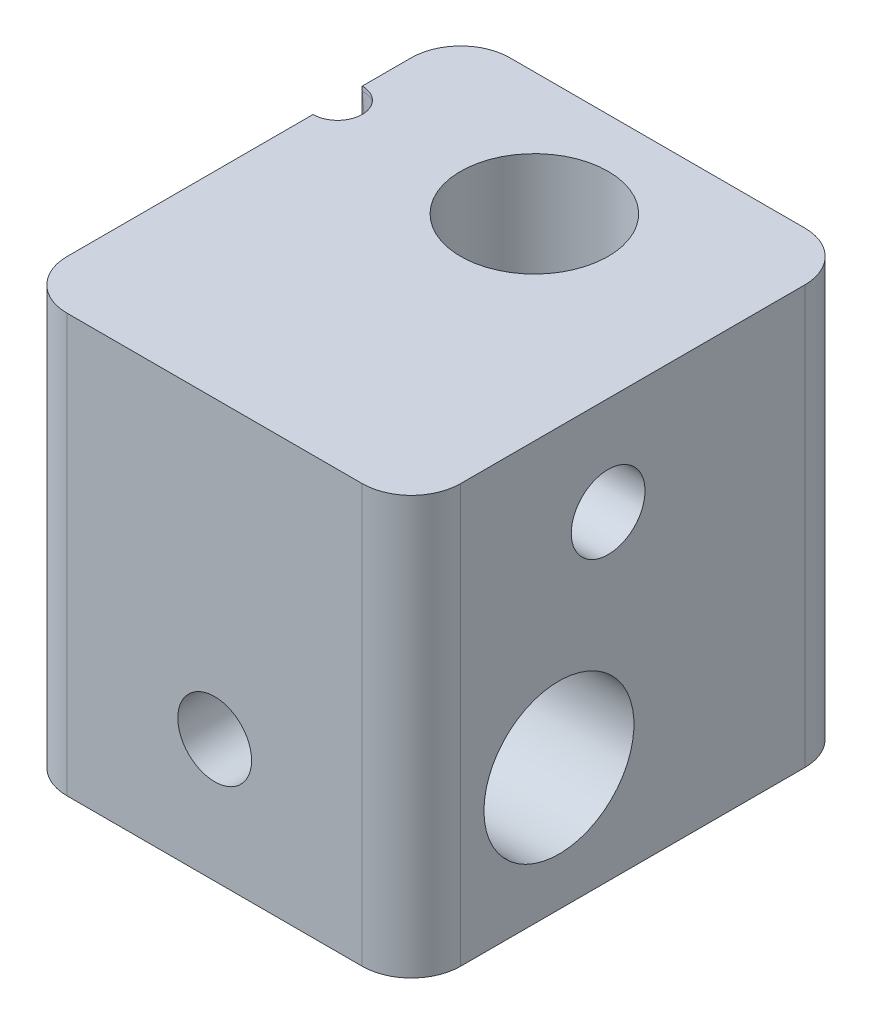
ISO-10303-21;
HEADER;
FILE_DESCRIPTION(('STEP AP214'),'2;1');
FILE_NAME('part.step','',(''),(''),'','','');
FILE_SCHEMA(('AUTOMOTIVE_DESIGN { 1 0 10303 214 1 1 1 1 }'));
ENDSEC;
DATA;
#1=APPLICATION_CONTEXT('core data for automotive mechanical design processes');
#2=APPLICATION_PROTOCOL_DEFINITION('international standard','automotive_design',2000,#1);
#3=PRODUCT_CONTEXT('',#1,'mechanical');
#4=PRODUCT('Part','Part','',(#3));
#5=PRODUCT_RELATED_PRODUCT_CATEGORY('part','',(#4));
#6=PRODUCT_DEFINITION_FORMATION('','',#4);
#7=PRODUCT_DEFINITION_CONTEXT('part definition',#1,'design');
#8=PRODUCT_DEFINITION('design','',#6,#7);
#9=PRODUCT_DEFINITION_SHAPE('','',#8);
#10=(LENGTH_UNIT() NAMED_UNIT(*) SI_UNIT(.MILLI.,.METRE.));
#11=(NAMED_UNIT(*) PLANE_ANGLE_UNIT() SI_UNIT($,.RADIAN.));
#12=(NAMED_UNIT(*) SI_UNIT($,.STERADIAN.) SOLID_ANGLE_UNIT());
#13=UNCERTAINTY_MEASURE_WITH_UNIT(LENGTH_MEASURE(1.E-05),#10,'distance_accuracy_value','');
#14=(GEOMETRIC_REPRESENTATION_CONTEXT(3) GLOBAL_UNCERTAINTY_ASSIGNED_CONTEXT((#13)) GLOBAL_UNIT_ASSIGNED_CONTEXT((#10,
#11,#12)) REPRESENTATION_CONTEXT('',''));
#15=CARTESIAN_POINT('',(0.,0.,0.));
#16=DIRECTION('',(0.,0.,1.));
#17=DIRECTION('',(1.,0.,0.));
#18=AXIS2_PLACEMENT_3D('',#15,#16,#17);
#19=CARTESIAN_POINT('',(-4.98343497282561,-18.5820883092853,0.));
#20=DIRECTION('',(-0.207911690817948,0.978147600733765,0.));
#21=DIRECTION('',(-0.978147600733765,-0.207911690817948,0.));
#22=AXIS2_PLACEMENT_3D('',#19,#20,#21);
#23=CONICAL_SURFACE('',#22,0.999999999755641,1.04719755102138);
#24=CARTESIAN_POINT('',(-4.983434972844,-18.5820883091807,0.));
#25=DIRECTION('',(0.20791169081795,-0.978147600733765,0.));
#26=DIRECTION('',(0.978147600733765,0.20791169081795,0.));
#27=AXIS2_PLACEMENT_3D('',#24,#25,#26);
#28=CIRCLE('',#27,1.000000000003);
#29=CARTESIAN_POINT('',(-4.0052873721073,-18.3741766183621,0.));
#30=VERTEX_POINT('',#29);
#31=EDGE_CURVE('E211',#30,#30,#28,.F.);
#32=ORIENTED_EDGE('',*,*,#31,.T.);
#33=EDGE_LOOP('',(#32));
#34=FACE_BOUND('',#33,.T.);
#35=CARTESIAN_POINT('',(-4.86339710198536,-19.146822089823,0.));
#36=VERTEX_POINT('',#35);
#37=VERTEX_LOOP('',#36);
#38=FACE_BOUND('',#37,.T.);
#39=ADVANCED_FACE('F17',(#34,#38),#23,.F.);
#40=CARTESIAN_POINT('',(-8.,-4.2,0.));
#41=DIRECTION('',(0.,1.,0.));
#42=DIRECTION('',(0.,0.,1.));
#43=AXIS2_PLACEMENT_3D('',#40,#41,#42);
#44=CYLINDRICAL_SURFACE('',#43,1.);
#45=CARTESIAN_POINT('',(-8.,-4.39026565523651,0.));
#46=DIRECTION('',(-0.10452846326775,0.994521895368263,0.));
#47=DIRECTION('',(0.994521895368263,0.104528463267751,0.));
#48=AXIS2_PLACEMENT_3D('',#45,#46,#47);
#49=ELLIPSE('',#48,1.00550827956503,1.0000000000015);
#50=CARTESIAN_POINT('',(-8.,-4.39026565523876,-1.00000000000075));
#51=VERTEX_POINT('',#50);
#52=CARTESIAN_POINT('',(-8.,-4.39026565523876,1.00000000000075));
#53=VERTEX_POINT('',#52);
#54=EDGE_CURVE('E213',#51,#53,#49,.F.);
#55=ORIENTED_EDGE('',*,*,#54,.T.);
#56=DIRECTION('',(0.,1.,0.));
#57=VECTOR('',#56,1.);
#58=CARTESIAN_POINT('',(-8.,-21.2,1.));
#59=LINE('',#58,#57);
#60=CARTESIAN_POINT('',(-8.,-4.2,1.));
#61=VERTEX_POINT('',#60);
#62=EDGE_CURVE('E108',#61,#53,#59,.F.);
#63=ORIENTED_EDGE('',*,*,#62,.F.);
#64=CARTESIAN_POINT('',(-8.,-4.2,0.));
#65=DIRECTION('',(0.,1.,0.));
#66=DIRECTION('',(0.,0.,1.));
#67=AXIS2_PLACEMENT_3D('',#64,#65,#66);
#68=CIRCLE('',#67,1.);
#69=CARTESIAN_POINT('',(-8.,-4.2,-0.999999999999997));
#70=VERTEX_POINT('',#69);
#71=EDGE_CURVE('E20',#70,#61,#68,.F.);
#72=ORIENTED_EDGE('',*,*,#71,.F.);
#73=DIRECTION('',(0.,1.,0.));
#74=VECTOR('',#73,1.);
#75=CARTESIAN_POINT('',(-8.,-4.2,-0.999999999999997));
#76=LINE('',#75,#74);
#77=EDGE_CURVE('E223',#51,#70,#76,.T.);
#78=ORIENTED_EDGE('',*,*,#77,.F.);
#79=EDGE_LOOP('',(#55,#63,#72,#78));
#80=FACE_BOUND('',#79,.T.);
#81=ADVANCED_FACE('F116',(#80),#44,.F.);
#82=CARTESIAN_POINT('',(-8.722304892623,-0.992088309182,0.));
#83=DIRECTION('',(0.20791169081795,-0.978147600733765,0.));
#84=DIRECTION('',(0.978147600733765,0.20791169081795,0.));
#85=AXIS2_PLACEMENT_3D('',#82,#83,#84);
#86=CYLINDRICAL_SURFACE('',#85,1.000000000003);
#87=ORIENTED_EDGE('',*,*,#31,.F.);
#88=EDGE_LOOP('',(#87));
#89=FACE_BOUND('',#88,.T.);
#90=ORIENTED_EDGE('',*,*,#54,.F.);
#91=CARTESIAN_POINT('',(-8.,-4.39026565523651,0.));
#92=DIRECTION('',(0.994521895368263,0.104528463267751,0.));
#93=DIRECTION('',(0.10452846326775,-0.994521895368263,0.));
#94=AXIS2_PLACEMENT_3D('',#91,#92,#93);
#95=ELLIPSE('',#94,9.56677223351109,1.0000000000015);
#96=CARTESIAN_POINT('',(-7.4944765498636,-9.2,-0.86281286578431));
#97=VERTEX_POINT('',#96);
#98=EDGE_CURVE('E216',#51,#97,#95,.F.);
#99=ORIENTED_EDGE('',*,*,#98,.T.);
#100=CARTESIAN_POINT('',(-6.97765940512988,-9.2,0.));
#101=DIRECTION('',(0.,-1.,0.));
#102=DIRECTION('',(1.,0.,0.));
#103=AXIS2_PLACEMENT_3D('',#100,#101,#102);
#104=ELLIPSE('',#103,1.02234059486814,1.000000000003);
#105=CARTESIAN_POINT('',(-7.99999999999901,-9.2,0.));
#106=VERTEX_POINT('',#105);
#107=EDGE_CURVE('E314',#97,#106,#104,.F.);
#108=ORIENTED_EDGE('',*,*,#107,.T.);
#109=CARTESIAN_POINT('',(-6.97765940512988,-9.2,0.));
#110=DIRECTION('',(0.,-1.,0.));
#111=DIRECTION('',(1.,0.,0.));
#112=AXIS2_PLACEMENT_3D('',#109,#110,#111);
#113=ELLIPSE('',#112,1.02234059486814,1.000000000003);
#114=CARTESIAN_POINT('',(-7.4944765498636,-9.2,0.862812865784316));
#115=VERTEX_POINT('',#114);
#116=EDGE_CURVE('E310',#106,#115,#113,.F.);
#117=ORIENTED_EDGE('',*,*,#116,.T.);
#118=CARTESIAN_POINT('',(-8.,-4.39026565523651,0.));
#119=DIRECTION('',(0.994521895368263,0.104528463267751,0.));
#120=DIRECTION('',(0.10452846326775,-0.994521895368263,0.));
#121=AXIS2_PLACEMENT_3D('',#118,#119,#120);
#122=ELLIPSE('',#121,9.56677223351109,1.0000000000015);
#123=EDGE_CURVE('E219',#115,#53,#122,.F.);
#124=ORIENTED_EDGE('',*,*,#123,.T.);
#125=EDGE_LOOP('',(#90,#99,#108,#117,#124));
#126=FACE_BOUND('',#125,.T.);
#127=ADVANCED_FACE('F122',(#89,#126),#86,.F.);
#128=CARTESIAN_POINT('',(0.,-16.2,13.));
#129=DIRECTION('',(0.,0.,1.));
#130=DIRECTION('',(1.,0.,0.));
#131=AXIS2_PLACEMENT_3D('',#128,#129,#130);
#132=CYLINDRICAL_SURFACE('',#131,1.5);
#133=CARTESIAN_POINT('',(1.49999999999999,-16.2,10.05));
#134=CARTESIAN_POINT('',(1.49999588378219,-16.2790792641972,10.0499964023692));
#135=CARTESIAN_POINT('',(1.4937146206715,-16.3582052113933,10.0468937514178));
#136=CARTESIAN_POINT('',(1.46887655214263,-16.5140802642296,10.034795690547));
#137=CARTESIAN_POINT('',(1.45030687607578,-16.5908267893855,10.0257941022894));
#138=CARTESIAN_POINT('',(1.40178960922588,-16.739520297169,10.0028420904239));
#139=CARTESIAN_POINT('',(1.37188161021216,-16.8114829681308,9.98890889836652));
#140=CARTESIAN_POINT('',(1.30175119316785,-16.949284327925,9.95737669583081));
#141=CARTESIAN_POINT('',(1.26152764048032,-17.015122341991,9.93977728212726));
#142=CARTESIAN_POINT('',(1.16920749708672,-17.1431572809057,9.90132428469071));
#143=CARTESIAN_POINT('',(1.11655041695048,-17.2049102019669,9.88033996875372));
#144=CARTESIAN_POINT('',(1.00206351367075,-17.3191131079778,9.83792244125353));
#145=CARTESIAN_POINT('',(0.940227382480664,-17.3715566404527,9.81648892976191));
#146=CARTESIAN_POINT('',(0.803610738906668,-17.4695628816859,9.77376601964667));
#147=CARTESIAN_POINT('',(0.728209398204683,-17.5143231608278,9.75260603119268));
#148=CARTESIAN_POINT('',(0.569792296813912,-17.5903379303135,9.71500847294651));
#149=CARTESIAN_POINT('',(0.486781854183811,-17.6216017674756,9.69856763760734));
#150=CARTESIAN_POINT('',(0.320511773382797,-17.6677416027565,9.67374064375681));
#151=CARTESIAN_POINT('',(0.237555669534098,-17.6834754926647,9.66493656752816));
#152=CARTESIAN_POINT('',(0.0697520563826837,-17.70074333129,9.6552549693639));
#153=CARTESIAN_POINT('',(-0.0150936219133724,-17.7022904740818,9.65437008237748));
#154=CARTESIAN_POINT('',(-0.173807340292347,-17.691771469488,9.66028864036623));
#155=CARTESIAN_POINT('',(-0.247817798860116,-17.6812471604657,9.66622145283045));
#156=CARTESIAN_POINT('',(-0.392845583261894,-17.6495463211888,9.68358691562924));
#157=CARTESIAN_POINT('',(-0.463862003221367,-17.6283665917506,9.69502121768605));
#158=CARTESIAN_POINT('',(-0.602907559836948,-17.5755602721388,9.72235769600561));
#159=CARTESIAN_POINT('',(-0.670828314810596,-17.5437014321888,9.73835790600877));
#160=CARTESIAN_POINT('',(-0.800679367603549,-17.4706178186129,9.773024393655));
#161=CARTESIAN_POINT('',(-0.862607103858366,-17.429389065044,9.79169180295681));
#162=CARTESIAN_POINT('',(-0.986673918029993,-17.3328643375092,9.83234536250517));
#163=CARTESIAN_POINT('',(-1.04791632921342,-17.2764656184389,9.85445849382707));
#164=CARTESIAN_POINT('',(-1.16045236324747,-17.1540780822321,9.89766218376757));
#165=CARTESIAN_POINT('',(-1.21173956827048,-17.0880831263123,9.91875207620763));
#166=CARTESIAN_POINT('',(-1.30500608339111,-16.9447073368076,9.95866276652997));
#167=CARTESIAN_POINT('',(-1.34647551548213,-16.8669528721426,9.97734258421105));
#168=CARTESIAN_POINT('',(-1.41536517523436,-16.704471949135,10.0091224868255));
#169=CARTESIAN_POINT('',(-1.44281228330905,-16.6197591944417,10.0222332393067));
#170=CARTESIAN_POINT('',(-1.47495998532321,-16.4785936318639,10.0377455452616));
#171=CARTESIAN_POINT('',(-1.4843272732221,-16.423400302244,10.0423179252092));
#172=CARTESIAN_POINT('',(-1.49684847485947,-16.3121457591359,10.0484462995146));
#173=CARTESIAN_POINT('',(-1.50000291930527,-16.2560846201892,10.0500025515129));
#174=CARTESIAN_POINT('',(-1.4999958837822,-16.1209207358028,10.0499964023692));
#175=CARTESIAN_POINT('',(-1.49371462067152,-16.0417947886067,10.0468937514178));
#176=CARTESIAN_POINT('',(-1.46887655214264,-15.8859197357704,10.034795690547));
#177=CARTESIAN_POINT('',(-1.4503068760758,-15.8091732106145,10.0257941022894));
#178=CARTESIAN_POINT('',(-1.4017896092259,-15.660479702831,10.0028420904239));
#179=CARTESIAN_POINT('',(-1.37188161021217,-15.5885170318692,9.98890889836652));
#180=CARTESIAN_POINT('',(-1.30175119316786,-15.450715672075,9.95737669583081));
#181=CARTESIAN_POINT('',(-1.26152764048034,-15.384877658009,9.93977728212726));
#182=CARTESIAN_POINT('',(-1.16920749708674,-15.2568427190943,9.90132428469071));
#183=CARTESIAN_POINT('',(-1.11655041695049,-15.1950897980331,9.88033996875371));
#184=CARTESIAN_POINT('',(-1.00206351367077,-15.0808868920222,9.83792244125353));
#185=CARTESIAN_POINT('',(-0.94022738248068,-15.0284433595473,9.81648892976191));
#186=CARTESIAN_POINT('',(-0.803610738906686,-14.9304371183141,9.77376601964667));
#187=CARTESIAN_POINT('',(-0.728209398204701,-14.8856768391722,9.75260603119268));
#188=CARTESIAN_POINT('',(-0.569792296813931,-14.8096620696865,9.7150084729465));
#189=CARTESIAN_POINT('',(-0.486781854183829,-14.7783982325244,9.69856763760733));
#190=CARTESIAN_POINT('',(-0.320511773382814,-14.7322583972435,9.67374064375681));
#191=CARTESIAN_POINT('',(-0.237555669534115,-14.7165245073353,9.66493656752816));
#192=CARTESIAN_POINT('',(-0.0697520563826995,-14.69925666871,9.6552549693639));
#193=CARTESIAN_POINT('',(0.0150936219133574,-14.6977095259182,9.65437008237747));
#194=CARTESIAN_POINT('',(0.173807340292332,-14.708228530512,9.66028864036623));
#195=CARTESIAN_POINT('',(0.247817798860101,-14.7187528395343,9.66622145283044));
#196=CARTESIAN_POINT('',(0.392845583261879,-14.7504536788112,9.68358691562924));
#197=CARTESIAN_POINT('',(0.463862003221352,-14.7716334082494,9.69502121768604));
#198=CARTESIAN_POINT('',(0.602907559836932,-14.8244397278612,9.72235769600561));
#199=CARTESIAN_POINT('',(0.670828314810579,-14.8562985678112,9.73835790600877));
#200=CARTESIAN_POINT('',(0.800679367603532,-14.9293821813871,9.773024393655));
#201=CARTESIAN_POINT('',(0.86260710385835,-14.970610934956,9.7916918029568));
#202=CARTESIAN_POINT('',(0.986673918029977,-15.0671356624908,9.83234536250516));
#203=CARTESIAN_POINT('',(1.0479163292134,-15.1235343815611,9.85445849382706));
#204=CARTESIAN_POINT('',(1.16045236324746,-15.2459219177679,9.89766218376757));
#205=CARTESIAN_POINT('',(1.21173956827046,-15.3119168736876,9.91875207620763));
#206=CARTESIAN_POINT('',(1.3050060833911,-15.4552926631924,9.95866276652997));
#207=CARTESIAN_POINT('',(1.34647551548212,-15.5330471278574,9.97734258421104));
#208=CARTESIAN_POINT('',(1.41536517523434,-15.695528050865,10.0091224868255));
#209=CARTESIAN_POINT('',(1.44281228330904,-15.7802408055583,10.0222332393067));
#210=CARTESIAN_POINT('',(1.4749599853232,-15.9214063681361,10.0377455452616));
#211=CARTESIAN_POINT('',(1.48432727322209,-15.976599697756,10.0423179252092));
#212=CARTESIAN_POINT('',(1.49684847485946,-16.0878542408641,10.0484462995146));
#213=CARTESIAN_POINT('',(1.50000291930525,-16.1439153798108,10.0500025515129));
#214=CARTESIAN_POINT('',(1.49999999999999,-16.2,10.05));
#215=B_SPLINE_CURVE_WITH_KNOTS('',3,(#133,#134,#135,#136,#137,#138,#139,#140,#141,#142,#143,
#144,#145,#146,#147,#148,#149,#150,#151,#152,#153,#154,#155,#156,#157,#158,#159,#160,#161,#162,
#163,#164,#165,#166,#167,#168,#169,#170,#171,#172,#173,#174,#175,#176,#177,#178,#179,#180,#181,
#182,#183,#184,#185,#186,#187,#188,#189,#190,#191,#192,#193,#194,#195,#196,#197,#198,#199,#200,
#201,#202,#203,#204,#205,#206,#207,#208,#209,#210,#211,#212,#213,#214),.UNSPECIFIED.,.T.,.F.,(4,
2,2,2,2,2,2,2,2,2,2,2,2,2,2,2,2,2,2,2,2,2,2,2,2,2,2,2,2,2,2,2,2,2,2,2,2,2,2,2,4),(0.,
0.237017868723352,0.474284379177947,0.710729908829203,0.947201457414916,1.19762477341366,
1.44822098948347,1.71746501961123,1.98652228733109,2.2397085936752,2.49265940570788,
2.71658248244488,2.94057283000486,3.169790113446,3.39910494126796,3.65640722664034,
3.91387484027444,4.18269037109205,4.45098863783775,4.61910088487096,4.78719877096474,
5.0242166396881,5.26148315014269,5.49792867979394,5.73440022837966,5.9848235443784,
6.23541976044821,6.50466379057596,6.77372105829583,7.02690736463994,7.27985817667262,
7.50378125340962,7.7277716009696,7.95698888441074,8.1863037122327,8.44360599760508,
8.70107361123918,8.96988914205679,9.23818740880249,9.4062996558357,9.57439754192949),.UNSPECIFIED.);
#216=CARTESIAN_POINT('',(1.49999999999999,-16.2,10.05));
#217=VERTEX_POINT('',#216);
#218=EDGE_CURVE('E185',#217,#217,#215,.T.);
#219=ORIENTED_EDGE('',*,*,#218,.T.);
#220=EDGE_LOOP('',(#219));
#221=FACE_BOUND('',#220,.T.);
#222=CARTESIAN_POINT('',(0.,-16.2,13.));
#223=DIRECTION('',(0.,0.,1.));
#224=DIRECTION('',(1.,0.,0.));
#225=AXIS2_PLACEMENT_3D('',#222,#223,#224);
#226=CIRCLE('',#225,1.5);
#227=CARTESIAN_POINT('',(1.49999999999999,-16.2,13.));
#228=VERTEX_POINT('',#227);
#229=EDGE_CURVE('E283',#228,#228,#226,.T.);
#230=ORIENTED_EDGE('',*,*,#229,.T.);
#231=EDGE_LOOP('',(#230));
#232=FACE_BOUND('',#231,.T.);
#233=ADVANCED_FACE('F197',(#221,#232),#132,.F.);
#234=CARTESIAN_POINT('',(-8.,-4.2,0.));
#235=DIRECTION('',(0.,1.,0.));
#236=DIRECTION('',(0.,0.,1.));
#237=AXIS2_PLACEMENT_3D('',#234,#235,#236);
#238=CYLINDRICAL_SURFACE('',#237,1.);
#239=ORIENTED_EDGE('',*,*,#98,.F.);
#240=DIRECTION('',(0.,1.,0.));
#241=VECTOR('',#240,1.);
#242=CARTESIAN_POINT('',(-8.,-21.2,-1.));
#243=LINE('',#242,#241);
#244=CARTESIAN_POINT('',(-8.,-9.2,-0.999999999999999));
#245=VERTEX_POINT('',#244);
#246=EDGE_CURVE('E230',#51,#245,#243,.F.);
#247=ORIENTED_EDGE('',*,*,#246,.T.);
#248=CARTESIAN_POINT('',(-8.,-9.2,0.));
#249=DIRECTION('',(0.,1.,0.));
#250=DIRECTION('',(0.,0.,1.));
#251=AXIS2_PLACEMENT_3D('',#248,#249,#250);
#252=CIRCLE('',#251,1.);
#253=EDGE_CURVE('E231',#245,#97,#252,.F.);
#254=ORIENTED_EDGE('',*,*,#253,.T.);
#255=EDGE_LOOP('',(#239,#247,#254));
#256=FACE_BOUND('',#255,.T.);
#257=ADVANCED_FACE('F202',(#256),#238,.F.);
#258=CARTESIAN_POINT('',(-8.,-9.2,1.));
#259=DIRECTION('',(0.,-1.,0.));
#260=DIRECTION('',(0.,0.,-1.));
#261=AXIS2_PLACEMENT_3D('',#258,#259,#260);
#262=PLANE('',#261);
#263=ORIENTED_EDGE('',*,*,#253,.F.);
#264=DIRECTION('',(0.,0.,-1.));
#265=VECTOR('',#264,1.);
#266=CARTESIAN_POINT('',(-8.,-9.2,-3.));
#267=LINE('',#266,#265);
#268=EDGE_CURVE('E236',#245,#106,#267,.F.);
#269=ORIENTED_EDGE('',*,*,#268,.T.);
#270=ORIENTED_EDGE('',*,*,#107,.F.);
#271=EDGE_LOOP('',(#263,#269,#270));
#272=FACE_BOUND('',#271,.T.);
#273=ADVANCED_FACE('F313',(#272),#262,.F.);
#274=CARTESIAN_POINT('',(-8.,-9.2,-1.));
#275=DIRECTION('',(0.,-1.,0.));
#276=DIRECTION('',(0.,0.,-1.));
#277=AXIS2_PLACEMENT_3D('',#274,#275,#276);
#278=PLANE('',#277);
#279=DIRECTION('',(0.,0.,-1.));
#280=VECTOR('',#279,1.);
#281=CARTESIAN_POINT('',(-8.,-9.2,-3.));
#282=LINE('',#281,#280);
#283=CARTESIAN_POINT('',(-8.,-9.2,1.));
#284=VERTEX_POINT('',#283);
#285=EDGE_CURVE('E239',#106,#284,#282,.F.);
#286=ORIENTED_EDGE('',*,*,#285,.T.);
#287=CARTESIAN_POINT('',(-8.,-9.2,0.));
#288=DIRECTION('',(0.,1.,0.));
#289=DIRECTION('',(0.,0.,1.));
#290=AXIS2_PLACEMENT_3D('',#287,#288,#289);
#291=CIRCLE('',#290,1.);
#292=EDGE_CURVE('E193',#284,#115,#291,.T.);
#293=ORIENTED_EDGE('',*,*,#292,.T.);
#294=ORIENTED_EDGE('',*,*,#116,.F.);
#295=EDGE_LOOP('',(#286,#293,#294));
#296=FACE_BOUND('',#295,.T.);
#297=ADVANCED_FACE('F309',(#296),#278,.F.);
#298=CARTESIAN_POINT('',(-8.,-4.2,0.));
#299=DIRECTION('',(0.,1.,0.));
#300=DIRECTION('',(0.,0.,1.));
#301=AXIS2_PLACEMENT_3D('',#298,#299,#300);
#302=CYLINDRICAL_SURFACE('',#301,1.);
#303=DIRECTION('',(0.,1.,0.));
#304=VECTOR('',#303,1.);
#305=CARTESIAN_POINT('',(-8.,-21.2,1.));
#306=LINE('',#305,#304);
#307=EDGE_CURVE('E305',#284,#53,#306,.T.);
#308=ORIENTED_EDGE('',*,*,#307,.T.);
#309=ORIENTED_EDGE('',*,*,#123,.F.);
#310=ORIENTED_EDGE('',*,*,#292,.F.);
#311=EDGE_LOOP('',(#308,#309,#310));
#312=FACE_BOUND('',#311,.T.);
#313=ADVANCED_FACE('F181',(#312),#302,.F.);
#314=CARTESIAN_POINT('',(-8.,-16.2,7.));
#315=DIRECTION('',(-1.,0.,0.));
#316=DIRECTION('',(0.,0.,1.));
#317=AXIS2_PLACEMENT_3D('',#314,#315,#316);
#318=CYLINDRICAL_SURFACE('',#317,3.05);
#319=CARTESIAN_POINT('',(-8.,-16.2,7.));
#320=DIRECTION('',(-1.,0.,0.));
#321=DIRECTION('',(0.,0.,1.));
#322=AXIS2_PLACEMENT_3D('',#319,#320,#321);
#323=CIRCLE('',#322,3.05);
#324=CARTESIAN_POINT('',(-8.,-16.2,10.05));
#325=VERTEX_POINT('',#324);
#326=EDGE_CURVE('E280',#325,#325,#323,.T.);
#327=ORIENTED_EDGE('',*,*,#326,.T.);
#328=EDGE_LOOP('',(#327));
#329=FACE_BOUND('',#328,.T.);
#330=CARTESIAN_POINT('',(8.,-16.2,7.00000000000001));
#331=DIRECTION('',(-1.,0.,0.));
#332=DIRECTION('',(0.,0.,1.));
#333=AXIS2_PLACEMENT_3D('',#330,#331,#332);
#334=CIRCLE('',#333,3.05);
#335=CARTESIAN_POINT('',(8.,-16.2,10.05));
#336=VERTEX_POINT('',#335);
#337=EDGE_CURVE('E286',#336,#336,#334,.F.);
#338=ORIENTED_EDGE('',*,*,#337,.T.);
#339=EDGE_LOOP('',(#338));
#340=FACE_BOUND('',#339,.T.);
#341=ORIENTED_EDGE('',*,*,#218,.F.);
#342=EDGE_LOOP('',(#341));
#343=FACE_BOUND('',#342,.T.);
#344=ADVANCED_FACE('F176',(#329,#340,#343),#318,.F.);
#345=CARTESIAN_POINT('',(-8.,-8.2,5.));
#346=DIRECTION('',(-1.,0.,0.));
#347=DIRECTION('',(0.,0.,1.));
#348=AXIS2_PLACEMENT_3D('',#345,#346,#347);
#349=CYLINDRICAL_SURFACE('',#348,1.5);
#350=CARTESIAN_POINT('',(8.,-8.20000000000001,5.00000000000001));
#351=DIRECTION('',(-1.,0.,0.));
#352=DIRECTION('',(0.,0.,1.));
#353=AXIS2_PLACEMENT_3D('',#350,#351,#352);
#354=CIRCLE('',#353,1.5);
#355=CARTESIAN_POINT('',(8.,-8.20000000000001,6.50000000000001));
#356=VERTEX_POINT('',#355);
#357=EDGE_CURVE('E194',#356,#356,#354,.F.);
#358=ORIENTED_EDGE('',*,*,#357,.T.);
#359=EDGE_LOOP('',(#358));
#360=FACE_BOUND('',#359,.T.);
#361=CARTESIAN_POINT('',(-8.,-8.2,5.));
#362=DIRECTION('',(-1.,0.,0.));
#363=DIRECTION('',(0.,0.,1.));
#364=AXIS2_PLACEMENT_3D('',#361,#362,#363);
#365=CIRCLE('',#364,1.5);
#366=CARTESIAN_POINT('',(-8.,-8.2,6.5));
#367=VERTEX_POINT('',#366);
#368=EDGE_CURVE('E277',#367,#367,#365,.T.);
#369=ORIENTED_EDGE('',*,*,#368,.T.);
#370=EDGE_LOOP('',(#369));
#371=FACE_BOUND('',#370,.T.);
#372=ADVANCED_FACE('F172',(#360,#371),#349,.F.);
#373=CARTESIAN_POINT('',(-6.,-21.2,-3.));
#374=DIRECTION('',(0.,-1.,0.));
#375=DIRECTION('',(0.,0.,-1.));
#376=AXIS2_PLACEMENT_3D('',#373,#374,#375);
#377=CYLINDRICAL_SURFACE('',#376,2.);
#378=CARTESIAN_POINT('',(-6.,-4.2,-3.));
#379=DIRECTION('',(0.,-1.,0.));
#380=DIRECTION('',(0.,0.,-1.));
#381=AXIS2_PLACEMENT_3D('',#378,#379,#380);
#382=CIRCLE('',#381,2.);
#383=CARTESIAN_POINT('',(-8.,-4.2,-3.));
#384=VERTEX_POINT('',#383);
#385=CARTESIAN_POINT('',(-6.,-4.2,-5.));
#386=VERTEX_POINT('',#385);
#387=EDGE_CURVE('E261',#384,#386,#382,.T.);
#388=ORIENTED_EDGE('',*,*,#387,.T.);
#389=DIRECTION('',(0.,1.,0.));
#390=VECTOR('',#389,1.);
#391=CARTESIAN_POINT('',(-6.,-21.2,-5.00000000000001));
#392=LINE('',#391,#390);
#393=CARTESIAN_POINT('',(-6.,-21.2,-5.));
#394=VERTEX_POINT('',#393);
#395=EDGE_CURVE('E192',#386,#394,#392,.F.);
#396=ORIENTED_EDGE('',*,*,#395,.T.);
#397=CARTESIAN_POINT('',(-6.,-21.2,-3.));
#398=DIRECTION('',(0.,-1.,0.));
#399=DIRECTION('',(0.,0.,-1.));
#400=AXIS2_PLACEMENT_3D('',#397,#398,#399);
#401=CIRCLE('',#400,2.);
#402=CARTESIAN_POINT('',(-8.,-21.2,-3.));
#403=VERTEX_POINT('',#402);
#404=EDGE_CURVE('E275',#403,#394,#401,.T.);
#405=ORIENTED_EDGE('',*,*,#404,.F.);
#406=DIRECTION('',(0.,1.,0.));
#407=VECTOR('',#406,1.);
#408=CARTESIAN_POINT('',(-8.,-21.2,-3.));
#409=LINE('',#408,#407);
#410=EDGE_CURVE('E237',#403,#384,#409,.T.);
#411=ORIENTED_EDGE('',*,*,#410,.T.);
#412=EDGE_LOOP('',(#388,#396,#405,#411));
#413=FACE_BOUND('',#412,.T.);
#414=ADVANCED_FACE('F168',(#413),#377,.T.);
#415=CARTESIAN_POINT('',(6.,-21.2,-5.));
#416=DIRECTION('',(0.,0.,1.));
#417=DIRECTION('',(1.,0.,0.));
#418=AXIS2_PLACEMENT_3D('',#415,#416,#417);
#419=PLANE('',#418);
#420=ORIENTED_EDGE('',*,*,#395,.F.);
#421=DIRECTION('',(1.,0.,0.));
#422=VECTOR('',#421,1.);
#423=CARTESIAN_POINT('',(-8.,-4.2,-5.));
#424=LINE('',#423,#422);
#425=CARTESIAN_POINT('',(6.,-4.2,-5.));
#426=VERTEX_POINT('',#425);
#427=EDGE_CURVE('E260',#386,#426,#424,.T.);
#428=ORIENTED_EDGE('',*,*,#427,.T.);
#429=DIRECTION('',(0.,-1.,0.));
#430=VECTOR('',#429,1.);
#431=CARTESIAN_POINT('',(6.,-21.2,-5.));
#432=LINE('',#431,#430);
#433=CARTESIAN_POINT('',(6.,-21.2,-5.));
#434=VERTEX_POINT('',#433);
#435=EDGE_CURVE('E296',#434,#426,#432,.F.);
#436=ORIENTED_EDGE('',*,*,#435,.F.);
#437=DIRECTION('',(1.,0.,0.));
#438=VECTOR('',#437,1.);
#439=CARTESIAN_POINT('',(-8.,-21.2,-5.));
#440=LINE('',#439,#438);
#441=EDGE_CURVE('E274',#394,#434,#440,.T.);
#442=ORIENTED_EDGE('',*,*,#441,.F.);
#443=EDGE_LOOP('',(#420,#428,#436,#442));
#444=FACE_BOUND('',#443,.T.);
#445=ADVANCED_FACE('F164',(#444),#419,.F.);
#446=CARTESIAN_POINT('',(6.,-21.2,-3.));
#447=DIRECTION('',(0.,-1.,0.));
#448=DIRECTION('',(0.,0.,-1.));
#449=AXIS2_PLACEMENT_3D('',#446,#447,#448);
#450=CYLINDRICAL_SURFACE('',#449,2.);
#451=CARTESIAN_POINT('',(6.,-4.2,-3.));
#452=DIRECTION('',(0.,-1.,0.));
#453=DIRECTION('',(0.,0.,-1.));
#454=AXIS2_PLACEMENT_3D('',#451,#452,#453);
#455=CIRCLE('',#454,2.);
#456=CARTESIAN_POINT('',(8.00000000000001,-4.2,-3.));
#457=VERTEX_POINT('',#456);
#458=EDGE_CURVE('E257',#426,#457,#455,.T.);
#459=ORIENTED_EDGE('',*,*,#458,.T.);
#460=DIRECTION('',(0.,1.,0.));
#461=VECTOR('',#460,1.);
#462=CARTESIAN_POINT('',(8.00000000000001,-21.2,-3.));
#463=LINE('',#462,#461);
#464=CARTESIAN_POINT('',(8.,-21.2,-3.));
#465=VERTEX_POINT('',#464);
#466=EDGE_CURVE('E293',#457,#465,#463,.F.);
#467=ORIENTED_EDGE('',*,*,#466,.T.);
#468=CARTESIAN_POINT('',(6.,-21.2,-3.));
#469=DIRECTION('',(0.,-1.,0.));
#470=DIRECTION('',(0.,0.,-1.));
#471=AXIS2_PLACEMENT_3D('',#468,#469,#470);
#472=CIRCLE('',#471,2.);
#473=EDGE_CURVE('E272',#434,#465,#472,.T.);
#474=ORIENTED_EDGE('',*,*,#473,.F.);
#475=ORIENTED_EDGE('',*,*,#435,.T.);
#476=EDGE_LOOP('',(#459,#467,#474,#475));
#477=FACE_BOUND('',#476,.T.);
#478=ADVANCED_FACE('F160',(#477),#450,.T.);
#479=CARTESIAN_POINT('',(8.,-21.2,11.));
#480=DIRECTION('',(-1.,0.,0.));
#481=DIRECTION('',(0.,0.,1.));
#482=AXIS2_PLACEMENT_3D('',#479,#480,#481);
#483=PLANE('',#482);
#484=ORIENTED_EDGE('',*,*,#337,.F.);
#485=EDGE_LOOP('',(#484));
#486=FACE_BOUND('',#485,.T.);
#487=ORIENTED_EDGE('',*,*,#357,.F.);
#488=EDGE_LOOP('',(#487));
#489=FACE_BOUND('',#488,.T.);
#490=ORIENTED_EDGE('',*,*,#466,.F.);
#491=DIRECTION('',(0.,0.,-1.));
#492=VECTOR('',#491,1.);
#493=CARTESIAN_POINT('',(8.,-4.2,-3.));
#494=LINE('',#493,#492);
#495=CARTESIAN_POINT('',(8.,-4.2,11.));
#496=VERTEX_POINT('',#495);
#497=EDGE_CURVE('E256',#457,#496,#494,.F.);
#498=ORIENTED_EDGE('',*,*,#497,.T.);
#499=DIRECTION('',(0.,-1.,0.));
#500=VECTOR('',#499,1.);
#501=CARTESIAN_POINT('',(8.,-21.2,11.));
#502=LINE('',#501,#500);
#503=CARTESIAN_POINT('',(8.,-21.2,11.));
#504=VERTEX_POINT('',#503);
#505=EDGE_CURVE('E288',#504,#496,#502,.F.);
#506=ORIENTED_EDGE('',*,*,#505,.F.);
#507=DIRECTION('',(0.,0.,-1.));
#508=VECTOR('',#507,1.);
#509=CARTESIAN_POINT('',(8.,-21.2,-3.));
#510=LINE('',#509,#508);
#511=EDGE_CURVE('E271',#465,#504,#510,.F.);
#512=ORIENTED_EDGE('',*,*,#511,.F.);
#513=EDGE_LOOP('',(#490,#498,#506,#512));
#514=FACE_BOUND('',#513,.T.);
#515=ADVANCED_FACE('F156',(#486,#489,#514),#483,.F.);
#516=CARTESIAN_POINT('',(6.,-21.2,11.));
#517=DIRECTION('',(0.,-1.,0.));
#518=DIRECTION('',(0.,0.,-1.));
#519=AXIS2_PLACEMENT_3D('',#516,#517,#518);
#520=CYLINDRICAL_SURFACE('',#519,2.);
#521=CARTESIAN_POINT('',(6.,-4.2,11.));
#522=DIRECTION('',(0.,-1.,0.));
#523=DIRECTION('',(0.,0.,-1.));
#524=AXIS2_PLACEMENT_3D('',#521,#522,#523);
#525=CIRCLE('',#524,2.);
#526=CARTESIAN_POINT('',(6.,-4.2,13.));
#527=VERTEX_POINT('',#526);
#528=EDGE_CURVE('E253',#496,#527,#525,.T.);
#529=ORIENTED_EDGE('',*,*,#528,.T.);
#530=DIRECTION('',(0.,1.,0.));
#531=VECTOR('',#530,1.);
#532=CARTESIAN_POINT('',(6.,-21.2,13.));
#533=LINE('',#532,#531);
#534=CARTESIAN_POINT('',(6.,-21.2,13.));
#535=VERTEX_POINT('',#534);
#536=EDGE_CURVE('E285',#527,#535,#533,.F.);
#537=ORIENTED_EDGE('',*,*,#536,.T.);
#538=CARTESIAN_POINT('',(6.,-21.2,11.));
#539=DIRECTION('',(0.,-1.,0.));
#540=DIRECTION('',(0.,0.,-1.));
#541=AXIS2_PLACEMENT_3D('',#538,#539,#540);
#542=CIRCLE('',#541,2.);
#543=EDGE_CURVE('E269',#504,#535,#542,.T.);
#544=ORIENTED_EDGE('',*,*,#543,.F.);
#545=ORIENTED_EDGE('',*,*,#505,.T.);
#546=EDGE_LOOP('',(#529,#537,#544,#545));
#547=FACE_BOUND('',#546,.T.);
#548=ADVANCED_FACE('F152',(#547),#520,.T.);
#549=CARTESIAN_POINT('',(-6.,-21.2,13.));
#550=DIRECTION('',(0.,0.,-1.));
#551=DIRECTION('',(-1.,0.,0.));
#552=AXIS2_PLACEMENT_3D('',#549,#550,#551);
#553=PLANE('',#552);
#554=ORIENTED_EDGE('',*,*,#229,.F.);
#555=EDGE_LOOP('',(#554));
#556=FACE_BOUND('',#555,.T.);
#557=ORIENTED_EDGE('',*,*,#536,.F.);
#558=DIRECTION('',(1.,0.,0.));
#559=VECTOR('',#558,1.);
#560=CARTESIAN_POINT('',(-8.,-4.2,13.));
#561=LINE('',#560,#559);
#562=CARTESIAN_POINT('',(-6.,-4.2,13.));
#563=VERTEX_POINT('',#562);
#564=EDGE_CURVE('E252',#527,#563,#561,.F.);
#565=ORIENTED_EDGE('',*,*,#564,.T.);
#566=DIRECTION('',(0.,-1.,0.));
#567=VECTOR('',#566,1.);
#568=CARTESIAN_POINT('',(-6.,-21.2,13.));
#569=LINE('',#568,#567);
#570=CARTESIAN_POINT('',(-6.,-21.2,13.));
#571=VERTEX_POINT('',#570);
#572=EDGE_CURVE('E241',#571,#563,#569,.F.);
#573=ORIENTED_EDGE('',*,*,#572,.F.);
#574=DIRECTION('',(1.,0.,0.));
#575=VECTOR('',#574,1.);
#576=CARTESIAN_POINT('',(-8.,-21.2,13.));
#577=LINE('',#576,#575);
#578=EDGE_CURVE('E268',#535,#571,#577,.F.);
#579=ORIENTED_EDGE('',*,*,#578,.F.);
#580=EDGE_LOOP('',(#557,#565,#573,#579));
#581=FACE_BOUND('',#580,.T.);
#582=ADVANCED_FACE('F148',(#556,#581),#553,.F.);
#583=CARTESIAN_POINT('',(-6.,-21.2,11.));
#584=DIRECTION('',(0.,-1.,0.));
#585=DIRECTION('',(0.,0.,-1.));
#586=AXIS2_PLACEMENT_3D('',#583,#584,#585);
#587=CYLINDRICAL_SURFACE('',#586,2.);
#588=CARTESIAN_POINT('',(-6.,-4.2,11.));
#589=DIRECTION('',(0.,-1.,0.));
#590=DIRECTION('',(0.,0.,-1.));
#591=AXIS2_PLACEMENT_3D('',#588,#589,#590);
#592=CIRCLE('',#591,2.);
#593=CARTESIAN_POINT('',(-8.,-4.2,11.));
#594=VERTEX_POINT('',#593);
#595=EDGE_CURVE('E249',#563,#594,#592,.T.);
#596=ORIENTED_EDGE('',*,*,#595,.T.);
#597=DIRECTION('',(0.,1.,0.));
#598=VECTOR('',#597,1.);
#599=CARTESIAN_POINT('',(-8.00000000000001,-21.2,11.));
#600=LINE('',#599,#598);
#601=CARTESIAN_POINT('',(-8.,-21.2,11.));
#602=VERTEX_POINT('',#601);
#603=EDGE_CURVE('E35',#594,#602,#600,.F.);
#604=ORIENTED_EDGE('',*,*,#603,.T.);
#605=CARTESIAN_POINT('',(-6.,-21.2,11.));
#606=DIRECTION('',(0.,-1.,0.));
#607=DIRECTION('',(0.,0.,-1.));
#608=AXIS2_PLACEMENT_3D('',#605,#606,#607);
#609=CIRCLE('',#608,2.);
#610=EDGE_CURVE('E265',#571,#602,#609,.T.);
#611=ORIENTED_EDGE('',*,*,#610,.F.);
#612=ORIENTED_EDGE('',*,*,#572,.T.);
#613=EDGE_LOOP('',(#596,#604,#611,#612));
#614=FACE_BOUND('',#613,.T.);
#615=ADVANCED_FACE('F144',(#614),#587,.T.);
#616=CARTESIAN_POINT('',(-8.,-21.2,-3.));
#617=DIRECTION('',(1.,0.,0.));
#618=DIRECTION('',(0.,0.,-1.));
#619=AXIS2_PLACEMENT_3D('',#616,#617,#618);
#620=PLANE('',#619);
#621=ORIENTED_EDGE('',*,*,#368,.F.);
#622=EDGE_LOOP('',(#621));
#623=FACE_BOUND('',#622,.T.);
#624=ORIENTED_EDGE('',*,*,#326,.F.);
#625=EDGE_LOOP('',(#624));
#626=FACE_BOUND('',#625,.T.);
#627=DIRECTION('',(0.,0.,-1.));
#628=VECTOR('',#627,1.);
#629=CARTESIAN_POINT('',(-8.,-4.2,-3.));
#630=LINE('',#629,#628);
#631=EDGE_CURVE('E248',#594,#61,#630,.T.);
#632=ORIENTED_EDGE('',*,*,#631,.T.);
#633=ORIENTED_EDGE('',*,*,#62,.T.);
#634=ORIENTED_EDGE('',*,*,#307,.F.);
#635=ORIENTED_EDGE('',*,*,#285,.F.);
#636=ORIENTED_EDGE('',*,*,#268,.F.);
#637=ORIENTED_EDGE('',*,*,#246,.F.);
#638=ORIENTED_EDGE('',*,*,#77,.T.);
#639=DIRECTION('',(0.,0.,-1.));
#640=VECTOR('',#639,1.);
#641=CARTESIAN_POINT('',(-8.,-4.2,-3.));
#642=LINE('',#641,#640);
#643=EDGE_CURVE('E264',#70,#384,#642,.T.);
#644=ORIENTED_EDGE('',*,*,#643,.T.);
#645=ORIENTED_EDGE('',*,*,#410,.F.);
#646=DIRECTION('',(0.,0.,-1.));
#647=VECTOR('',#646,1.);
#648=CARTESIAN_POINT('',(-8.,-21.2,-3.));
#649=LINE('',#648,#647);
#650=EDGE_CURVE('E267',#602,#403,#649,.T.);
#651=ORIENTED_EDGE('',*,*,#650,.F.);
#652=ORIENTED_EDGE('',*,*,#603,.F.);
#653=EDGE_LOOP('',(#632,#633,#634,#635,#636,#637,#638,#644,#645,#651,#652));
#654=FACE_BOUND('',#653,.T.);
#655=ADVANCED_FACE('F140',(#623,#626,#654),#620,.F.);
#656=CARTESIAN_POINT('',(-8.,-21.2,-3.));
#657=DIRECTION('',(0.,-1.,0.));
#658=DIRECTION('',(0.,0.,-1.));
#659=AXIS2_PLACEMENT_3D('',#656,#657,#658);
#660=PLANE('',#659);
#661=CARTESIAN_POINT('',(0.,-21.2,0.));
#662=DIRECTION('',(0.,-1.,0.));
#663=DIRECTION('',(0.,0.,-1.));
#664=AXIS2_PLACEMENT_3D('',#661,#662,#663);
#665=CIRCLE('',#664,3.);
#666=CARTESIAN_POINT('',(0.,-21.2,-3.));
#667=VERTEX_POINT('',#666);
#668=EDGE_CURVE('E26',#667,#667,#665,.F.);
#669=ORIENTED_EDGE('',*,*,#668,.T.);
#670=EDGE_LOOP('',(#669));
#671=FACE_BOUND('',#670,.T.);
#672=ORIENTED_EDGE('',*,*,#610,.T.);
#673=ORIENTED_EDGE('',*,*,#650,.T.);
#674=ORIENTED_EDGE('',*,*,#404,.T.);
#675=ORIENTED_EDGE('',*,*,#441,.T.);
#676=ORIENTED_EDGE('',*,*,#473,.T.);
#677=ORIENTED_EDGE('',*,*,#511,.T.);
#678=ORIENTED_EDGE('',*,*,#543,.T.);
#679=ORIENTED_EDGE('',*,*,#578,.T.);
#680=EDGE_LOOP('',(#672,#673,#674,#675,#676,#677,#678,#679));
#681=FACE_BOUND('',#680,.T.);
#682=ADVANCED_FACE('F132',(#671,#681),#660,.T.);
#683=CARTESIAN_POINT('',(-8.,-4.2,-3.));
#684=DIRECTION('',(0.,-1.,0.));
#685=DIRECTION('',(0.,0.,-1.));
#686=AXIS2_PLACEMENT_3D('',#683,#684,#685);
#687=PLANE('',#686);
#688=CARTESIAN_POINT('',(0.,-4.2,0.));
#689=DIRECTION('',(0.,-1.,0.));
#690=DIRECTION('',(0.,0.,-1.));
#691=AXIS2_PLACEMENT_3D('',#688,#689,#690);
#692=CIRCLE('',#691,3.);
#693=CARTESIAN_POINT('',(0.,-4.2,-2.99999999999999));
#694=VERTEX_POINT('',#693);
#695=EDGE_CURVE('E11',#694,#694,#692,.T.);
#696=ORIENTED_EDGE('',*,*,#695,.T.);
#697=EDGE_LOOP('',(#696));
#698=FACE_BOUND('',#697,.T.);
#699=ORIENTED_EDGE('',*,*,#71,.T.);
#700=ORIENTED_EDGE('',*,*,#631,.F.);
#701=ORIENTED_EDGE('',*,*,#595,.F.);
#702=ORIENTED_EDGE('',*,*,#564,.F.);
#703=ORIENTED_EDGE('',*,*,#528,.F.);
#704=ORIENTED_EDGE('',*,*,#497,.F.);
#705=ORIENTED_EDGE('',*,*,#458,.F.);
#706=ORIENTED_EDGE('',*,*,#427,.F.);
#707=ORIENTED_EDGE('',*,*,#387,.F.);
#708=ORIENTED_EDGE('',*,*,#643,.F.);
#709=EDGE_LOOP('',(#699,#700,#701,#702,#703,#704,#705,#706,#707,#708));
#710=FACE_BOUND('',#709,.T.);
#711=ADVANCED_FACE('F126',(#698,#710),#687,.F.);
#712=CARTESIAN_POINT('',(0.,-21.2,0.));
#713=DIRECTION('',(0.,-1.,0.));
#714=DIRECTION('',(0.,0.,-1.));
#715=AXIS2_PLACEMENT_3D('',#712,#713,#714);
#716=CYLINDRICAL_SURFACE('',#715,3.);
#717=ORIENTED_EDGE('',*,*,#695,.F.);
#718=EDGE_LOOP('',(#717));
#719=FACE_BOUND('',#718,.T.);
#720=ORIENTED_EDGE('',*,*,#668,.F.);
#721=EDGE_LOOP('',(#720));
#722=FACE_BOUND('',#721,.T.);
#723=ADVANCED_FACE('F124',(#719,#722),#716,.F.);
#724=CLOSED_SHELL('',(#39,#81,#127,#233,#257,#273,#297,#313,#344,#372,#414,#445,#478,#515,#548,
#582,#615,#655,#682,#711,#723));
#725=MANIFOLD_SOLID_BREP('B1',#724);
#726=ADVANCED_BREP_SHAPE_REPRESENTATION('',(#18,#725),#14);
#727=SHAPE_DEFINITION_REPRESENTATION(#9,#726);
ENDSEC;
END-ISO-10303-21;
